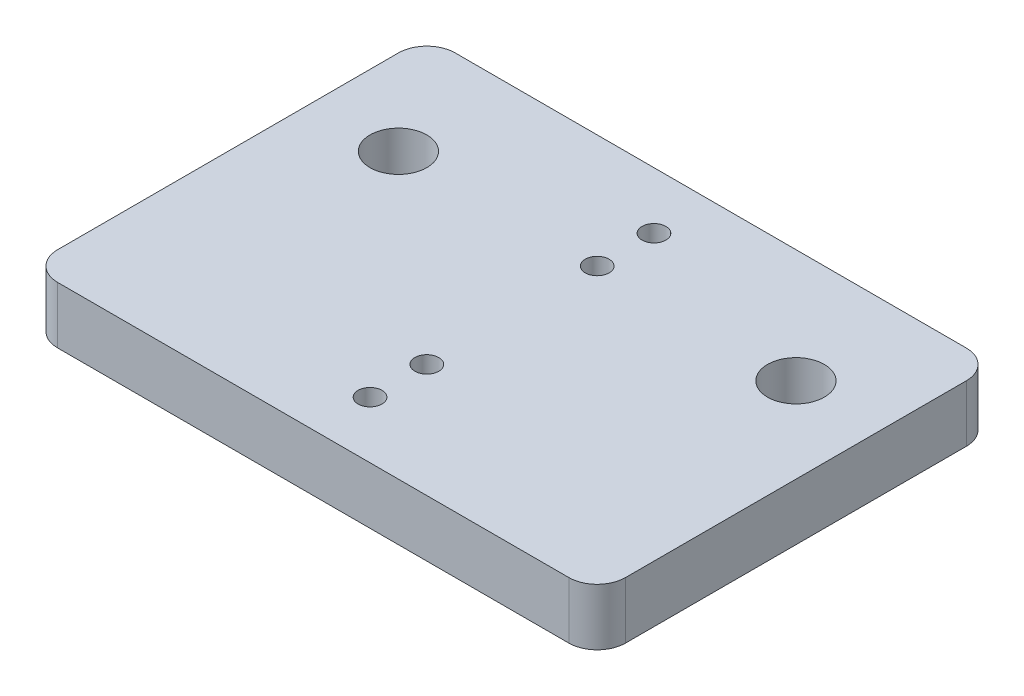
ISO-10303-21;
HEADER;
FILE_DESCRIPTION(('STEP AP214'),'2;1');
FILE_NAME('part.step','',(''),(''),'','','');
FILE_SCHEMA(('AUTOMOTIVE_DESIGN { 1 0 10303 214 1 1 1 1 }'));
ENDSEC;
DATA;
#1=APPLICATION_CONTEXT('core data for automotive mechanical design processes');
#2=APPLICATION_PROTOCOL_DEFINITION('international standard','automotive_design',2000,#1);
#3=PRODUCT_CONTEXT('',#1,'mechanical');
#4=PRODUCT('Part','Part','',(#3));
#5=PRODUCT_RELATED_PRODUCT_CATEGORY('part','',(#4));
#6=PRODUCT_DEFINITION_FORMATION('','',#4);
#7=PRODUCT_DEFINITION_CONTEXT('part definition',#1,'design');
#8=PRODUCT_DEFINITION('design','',#6,#7);
#9=PRODUCT_DEFINITION_SHAPE('','',#8);
#10=(LENGTH_UNIT() NAMED_UNIT(*) SI_UNIT(.MILLI.,.METRE.));
#11=(NAMED_UNIT(*) PLANE_ANGLE_UNIT() SI_UNIT($,.RADIAN.));
#12=(NAMED_UNIT(*) SI_UNIT($,.STERADIAN.) SOLID_ANGLE_UNIT());
#13=UNCERTAINTY_MEASURE_WITH_UNIT(LENGTH_MEASURE(1.E-05),#10,'distance_accuracy_value','');
#14=(GEOMETRIC_REPRESENTATION_CONTEXT(3) GLOBAL_UNCERTAINTY_ASSIGNED_CONTEXT((#13)) GLOBAL_UNIT_ASSIGNED_CONTEXT((#10,
#11,#12)) REPRESENTATION_CONTEXT('',''));
#15=CARTESIAN_POINT('',(0.,0.,0.));
#16=DIRECTION('',(0.,0.,1.));
#17=DIRECTION('',(1.,0.,0.));
#18=AXIS2_PLACEMENT_3D('',#15,#16,#17);
#19=CARTESIAN_POINT('',(0.,12.7,49.7470577878094));
#20=DIRECTION('',(0.,0.,-1.));
#21=DIRECTION('',(-1.,0.,0.));
#22=AXIS2_PLACEMENT_3D('',#19,#20,#21);
#23=PLANE('',#22);
#24=DIRECTION('',(1.,0.,0.));
#25=VECTOR('',#24,1.);
#26=CARTESIAN_POINT('',(0.,0.,49.7470577878094));
#27=LINE('',#26,#25);
#28=CARTESIAN_POINT('',(-57.15,0.,49.7470577878094));
#29=VERTEX_POINT('',#28);
#30=CARTESIAN_POINT('',(57.15,0.,49.7470577878094));
#31=VERTEX_POINT('',#30);
#32=EDGE_CURVE('E185',#29,#31,#27,.T.);
#33=ORIENTED_EDGE('',*,*,#32,.T.);
#34=DIRECTION('',(0.,-1.,0.));
#35=VECTOR('',#34,1.);
#36=CARTESIAN_POINT('',(57.15,12.7,49.7470577878094));
#37=LINE('',#36,#35);
#38=CARTESIAN_POINT('',(57.15,12.7,49.7470577878094));
#39=VERTEX_POINT('',#38);
#40=EDGE_CURVE('E11',#31,#39,#37,.F.);
#41=ORIENTED_EDGE('',*,*,#40,.T.);
#42=DIRECTION('',(1.,0.,0.));
#43=VECTOR('',#42,1.);
#44=CARTESIAN_POINT('',(0.,12.7,49.7470577878094));
#45=LINE('',#44,#43);
#46=CARTESIAN_POINT('',(-57.15,12.7,49.7470577878094));
#47=VERTEX_POINT('',#46);
#48=EDGE_CURVE('E160',#47,#39,#45,.T.);
#49=ORIENTED_EDGE('',*,*,#48,.F.);
#50=DIRECTION('',(0.,-1.,0.));
#51=VECTOR('',#50,1.);
#52=CARTESIAN_POINT('',(-57.15,12.7,49.7470577878094));
#53=LINE('',#52,#51);
#54=EDGE_CURVE('E48',#47,#29,#53,.T.);
#55=ORIENTED_EDGE('',*,*,#54,.T.);
#56=EDGE_LOOP('',(#33,#41,#49,#55));
#57=FACE_BOUND('',#56,.T.);
#58=ADVANCED_FACE('F40',(#57),#23,.F.);
#59=CARTESIAN_POINT('',(63.5,12.7,0.));
#60=DIRECTION('',(-1.,0.,0.));
#61=DIRECTION('',(0.,0.,1.));
#62=AXIS2_PLACEMENT_3D('',#59,#60,#61);
#63=PLANE('',#62);
#64=DIRECTION('',(0.,0.,-1.));
#65=VECTOR('',#64,1.);
#66=CARTESIAN_POINT('',(63.5,0.,0.));
#67=LINE('',#66,#65);
#68=CARTESIAN_POINT('',(63.5,0.,43.3970577878094));
#69=VERTEX_POINT('',#68);
#70=CARTESIAN_POINT('',(63.5,0.,-32.8029422121906));
#71=VERTEX_POINT('',#70);
#72=EDGE_CURVE('E140',#69,#71,#67,.T.);
#73=ORIENTED_EDGE('',*,*,#72,.T.);
#74=DIRECTION('',(0.,-1.,0.));
#75=VECTOR('',#74,1.);
#76=CARTESIAN_POINT('',(63.5,12.7,-32.8029422121906));
#77=LINE('',#76,#75);
#78=CARTESIAN_POINT('',(63.5,12.7,-32.8029422121906));
#79=VERTEX_POINT('',#78);
#80=EDGE_CURVE('E55',#71,#79,#77,.F.);
#81=ORIENTED_EDGE('',*,*,#80,.T.);
#82=DIRECTION('',(0.,0.,-1.));
#83=VECTOR('',#82,1.);
#84=CARTESIAN_POINT('',(63.5,12.7,0.));
#85=LINE('',#84,#83);
#86=CARTESIAN_POINT('',(63.5,12.7,43.3970577878094));
#87=VERTEX_POINT('',#86);
#88=EDGE_CURVE('E213',#87,#79,#85,.T.);
#89=ORIENTED_EDGE('',*,*,#88,.F.);
#90=DIRECTION('',(0.,-1.,0.));
#91=VECTOR('',#90,1.);
#92=CARTESIAN_POINT('',(63.5,12.7,43.3970577878094));
#93=LINE('',#92,#91);
#94=EDGE_CURVE('E177',#87,#69,#93,.T.);
#95=ORIENTED_EDGE('',*,*,#94,.T.);
#96=EDGE_LOOP('',(#73,#81,#89,#95));
#97=FACE_BOUND('',#96,.T.);
#98=ADVANCED_FACE('F221',(#97),#63,.F.);
#99=CARTESIAN_POINT('',(0.,12.7,-39.1529422121905));
#100=DIRECTION('',(0.,0.,-1.));
#101=DIRECTION('',(-1.,0.,0.));
#102=AXIS2_PLACEMENT_3D('',#99,#100,#101);
#103=PLANE('',#102);
#104=DIRECTION('',(1.,0.,0.));
#105=VECTOR('',#104,1.);
#106=CARTESIAN_POINT('',(0.,0.,-39.1529422121905));
#107=LINE('',#106,#105);
#108=CARTESIAN_POINT('',(-57.15,0.,-39.1529422121905));
#109=VERTEX_POINT('',#108);
#110=CARTESIAN_POINT('',(57.15,0.,-39.1529422121906));
#111=VERTEX_POINT('',#110);
#112=EDGE_CURVE('E134',#109,#111,#107,.T.);
#113=ORIENTED_EDGE('',*,*,#112,.F.);
#114=DIRECTION('',(0.,-1.,0.));
#115=VECTOR('',#114,1.);
#116=CARTESIAN_POINT('',(-57.15,12.7,-39.1529422121905));
#117=LINE('',#116,#115);
#118=CARTESIAN_POINT('',(-57.15,12.7,-39.1529422121905));
#119=VERTEX_POINT('',#118);
#120=EDGE_CURVE('E111',#109,#119,#117,.F.);
#121=ORIENTED_EDGE('',*,*,#120,.T.);
#122=DIRECTION('',(1.,0.,0.));
#123=VECTOR('',#122,1.);
#124=CARTESIAN_POINT('',(0.,12.7,-39.1529422121905));
#125=LINE('',#124,#123);
#126=CARTESIAN_POINT('',(57.15,12.7,-39.1529422121906));
#127=VERTEX_POINT('',#126);
#128=EDGE_CURVE('E210',#119,#127,#125,.T.);
#129=ORIENTED_EDGE('',*,*,#128,.T.);
#130=DIRECTION('',(0.,-1.,0.));
#131=VECTOR('',#130,1.);
#132=CARTESIAN_POINT('',(57.15,0.,-39.1529422121906));
#133=LINE('',#132,#131);
#134=EDGE_CURVE('E116',#127,#111,#133,.T.);
#135=ORIENTED_EDGE('',*,*,#134,.T.);
#136=EDGE_LOOP('',(#113,#121,#129,#135));
#137=FACE_BOUND('',#136,.T.);
#138=ADVANCED_FACE('F227',(#137),#103,.T.);
#139=CARTESIAN_POINT('',(0.,12.7,-13.7529422121905));
#140=DIRECTION('',(0.,-1.,0.));
#141=DIRECTION('',(0.,0.,-1.));
#142=AXIS2_PLACEMENT_3D('',#139,#140,#141);
#143=CYLINDRICAL_SURFACE('',#142,2.66699999999798);
#144=CARTESIAN_POINT('',(0.,12.7,-13.7529422121905));
#145=DIRECTION('',(0.,1.,0.));
#146=DIRECTION('',(0.,0.,1.));
#147=AXIS2_PLACEMENT_3D('',#144,#145,#146);
#148=CIRCLE('',#147,2.66699999999798);
#149=CARTESIAN_POINT('',(0.,12.7,-11.0859422121926));
#150=VERTEX_POINT('',#149);
#151=EDGE_CURVE('E194',#150,#150,#148,.T.);
#152=ORIENTED_EDGE('',*,*,#151,.T.);
#153=EDGE_LOOP('',(#152));
#154=FACE_BOUND('',#153,.T.);
#155=CARTESIAN_POINT('',(0.,0.,-13.7529422121905));
#156=DIRECTION('',(0.,1.,0.));
#157=DIRECTION('',(0.,0.,1.));
#158=AXIS2_PLACEMENT_3D('',#155,#156,#157);
#159=CIRCLE('',#158,2.66699999999798);
#160=CARTESIAN_POINT('',(0.,0.,-11.0859422121926));
#161=VERTEX_POINT('',#160);
#162=EDGE_CURVE('E153',#161,#161,#159,.T.);
#163=ORIENTED_EDGE('',*,*,#162,.F.);
#164=EDGE_LOOP('',(#163));
#165=FACE_BOUND('',#164,.T.);
#166=ADVANCED_FACE('F306',(#154,#165),#143,.F.);
#167=CARTESIAN_POINT('',(0.,12.7,-26.4529422121905));
#168=DIRECTION('',(0.,-1.,0.));
#169=DIRECTION('',(0.,0.,-1.));
#170=AXIS2_PLACEMENT_3D('',#167,#168,#169);
#171=CYLINDRICAL_SURFACE('',#170,2.66699999999798);
#172=CARTESIAN_POINT('',(0.,12.7,-26.4529422121905));
#173=DIRECTION('',(0.,1.,0.));
#174=DIRECTION('',(0.,0.,1.));
#175=AXIS2_PLACEMENT_3D('',#172,#173,#174);
#176=CIRCLE('',#175,2.66699999999798);
#177=CARTESIAN_POINT('',(0.,12.7,-23.7859422121926));
#178=VERTEX_POINT('',#177);
#179=EDGE_CURVE('E197',#178,#178,#176,.T.);
#180=ORIENTED_EDGE('',*,*,#179,.T.);
#181=EDGE_LOOP('',(#180));
#182=FACE_BOUND('',#181,.T.);
#183=CARTESIAN_POINT('',(0.,0.,-26.4529422121905));
#184=DIRECTION('',(0.,1.,0.));
#185=DIRECTION('',(0.,0.,1.));
#186=AXIS2_PLACEMENT_3D('',#183,#184,#185);
#187=CIRCLE('',#186,2.66699999999798);
#188=CARTESIAN_POINT('',(0.,0.,-23.7859422121926));
#189=VERTEX_POINT('',#188);
#190=EDGE_CURVE('E150',#189,#189,#187,.T.);
#191=ORIENTED_EDGE('',*,*,#190,.F.);
#192=EDGE_LOOP('',(#191));
#193=FACE_BOUND('',#192,.T.);
#194=ADVANCED_FACE('F357',(#182,#193),#171,.F.);
#195=CARTESIAN_POINT('',(44.45,12.7,-13.7529422121905));
#196=DIRECTION('',(0.,-1.,0.));
#197=DIRECTION('',(0.,0.,-1.));
#198=AXIS2_PLACEMENT_3D('',#195,#196,#197);
#199=CYLINDRICAL_SURFACE('',#198,6.34999999999799);
#200=CARTESIAN_POINT('',(44.45,12.7,-13.7529422121905));
#201=DIRECTION('',(0.,1.,0.));
#202=DIRECTION('',(0.,0.,1.));
#203=AXIS2_PLACEMENT_3D('',#200,#201,#202);
#204=CIRCLE('',#203,6.34999999999799);
#205=CARTESIAN_POINT('',(44.45,12.7,-7.40294221219256));
#206=VERTEX_POINT('',#205);
#207=EDGE_CURVE('E200',#206,#206,#204,.T.);
#208=ORIENTED_EDGE('',*,*,#207,.T.);
#209=EDGE_LOOP('',(#208));
#210=FACE_BOUND('',#209,.T.);
#211=CARTESIAN_POINT('',(44.45,0.,-13.7529422121905));
#212=DIRECTION('',(0.,1.,0.));
#213=DIRECTION('',(0.,0.,1.));
#214=AXIS2_PLACEMENT_3D('',#211,#212,#213);
#215=CIRCLE('',#214,6.34999999999799);
#216=CARTESIAN_POINT('',(44.45,0.,-7.40294221219256));
#217=VERTEX_POINT('',#216);
#218=EDGE_CURVE('E146',#217,#217,#215,.T.);
#219=ORIENTED_EDGE('',*,*,#218,.F.);
#220=EDGE_LOOP('',(#219));
#221=FACE_BOUND('',#220,.T.);
#222=ADVANCED_FACE('F348',(#210,#221),#199,.F.);
#223=CARTESIAN_POINT('',(0.,12.7,37.0470577878094));
#224=DIRECTION('',(0.,-1.,0.));
#225=DIRECTION('',(0.,0.,-1.));
#226=AXIS2_PLACEMENT_3D('',#223,#224,#225);
#227=CYLINDRICAL_SURFACE('',#226,2.66699999999798);
#228=CARTESIAN_POINT('',(0.,12.7,37.0470577878094));
#229=DIRECTION('',(0.,1.,0.));
#230=DIRECTION('',(0.,0.,1.));
#231=AXIS2_PLACEMENT_3D('',#228,#229,#230);
#232=CIRCLE('',#231,2.66699999999798);
#233=CARTESIAN_POINT('',(0.,12.7,39.7140577878074));
#234=VERTEX_POINT('',#233);
#235=EDGE_CURVE('E203',#234,#234,#232,.T.);
#236=ORIENTED_EDGE('',*,*,#235,.T.);
#237=EDGE_LOOP('',(#236));
#238=FACE_BOUND('',#237,.T.);
#239=CARTESIAN_POINT('',(0.,0.,37.0470577878094));
#240=DIRECTION('',(0.,1.,0.));
#241=DIRECTION('',(0.,0.,1.));
#242=AXIS2_PLACEMENT_3D('',#239,#240,#241);
#243=CIRCLE('',#242,2.66699999999798);
#244=CARTESIAN_POINT('',(0.,0.,39.7140577878074));
#245=VERTEX_POINT('',#244);
#246=EDGE_CURVE('E137',#245,#245,#243,.T.);
#247=ORIENTED_EDGE('',*,*,#246,.F.);
#248=EDGE_LOOP('',(#247));
#249=FACE_BOUND('',#248,.T.);
#250=ADVANCED_FACE('F337',(#238,#249),#227,.F.);
#251=CARTESIAN_POINT('',(0.,12.7,24.3470577878094));
#252=DIRECTION('',(0.,-1.,0.));
#253=DIRECTION('',(0.,0.,-1.));
#254=AXIS2_PLACEMENT_3D('',#251,#252,#253);
#255=CYLINDRICAL_SURFACE('',#254,2.66699999999798);
#256=CARTESIAN_POINT('',(0.,12.7,24.3470577878094));
#257=DIRECTION('',(0.,1.,0.));
#258=DIRECTION('',(0.,0.,1.));
#259=AXIS2_PLACEMENT_3D('',#256,#257,#258);
#260=CIRCLE('',#259,2.66699999999798);
#261=CARTESIAN_POINT('',(0.,12.7,27.0140577878074));
#262=VERTEX_POINT('',#261);
#263=EDGE_CURVE('E206',#262,#262,#260,.T.);
#264=ORIENTED_EDGE('',*,*,#263,.T.);
#265=EDGE_LOOP('',(#264));
#266=FACE_BOUND('',#265,.T.);
#267=CARTESIAN_POINT('',(0.,0.,24.3470577878094));
#268=DIRECTION('',(0.,1.,0.));
#269=DIRECTION('',(0.,0.,1.));
#270=AXIS2_PLACEMENT_3D('',#267,#268,#269);
#271=CIRCLE('',#270,2.66699999999798);
#272=CARTESIAN_POINT('',(0.,0.,27.0140577878074));
#273=VERTEX_POINT('',#272);
#274=EDGE_CURVE('E133',#273,#273,#271,.T.);
#275=ORIENTED_EDGE('',*,*,#274,.F.);
#276=EDGE_LOOP('',(#275));
#277=FACE_BOUND('',#276,.T.);
#278=ADVANCED_FACE('F294',(#266,#277),#255,.F.);
#279=CARTESIAN_POINT('',(-63.5,12.7,0.));
#280=DIRECTION('',(1.,0.,0.));
#281=DIRECTION('',(0.,0.,-1.));
#282=AXIS2_PLACEMENT_3D('',#279,#280,#281);
#283=PLANE('',#282);
#284=DIRECTION('',(0.,0.,1.));
#285=VECTOR('',#284,1.);
#286=CARTESIAN_POINT('',(-63.5,12.7,0.));
#287=LINE('',#286,#285);
#288=CARTESIAN_POINT('',(-63.5,12.7,-32.8029422121905));
#289=VERTEX_POINT('',#288);
#290=CARTESIAN_POINT('',(-63.5,12.7,43.3970577878094));
#291=VERTEX_POINT('',#290);
#292=EDGE_CURVE('E126',#289,#291,#287,.T.);
#293=ORIENTED_EDGE('',*,*,#292,.F.);
#294=DIRECTION('',(0.,-1.,0.));
#295=VECTOR('',#294,1.);
#296=CARTESIAN_POINT('',(-63.5,0.,-32.8029422121905));
#297=LINE('',#296,#295);
#298=CARTESIAN_POINT('',(-63.5,0.,-32.8029422121905));
#299=VERTEX_POINT('',#298);
#300=EDGE_CURVE('E110',#289,#299,#297,.T.);
#301=ORIENTED_EDGE('',*,*,#300,.T.);
#302=DIRECTION('',(0.,0.,1.));
#303=VECTOR('',#302,1.);
#304=CARTESIAN_POINT('',(-63.5,0.,0.));
#305=LINE('',#304,#303);
#306=CARTESIAN_POINT('',(-63.5,0.,43.3970577878094));
#307=VERTEX_POINT('',#306);
#308=EDGE_CURVE('E123',#299,#307,#305,.T.);
#309=ORIENTED_EDGE('',*,*,#308,.T.);
#310=DIRECTION('',(0.,-1.,0.));
#311=VECTOR('',#310,1.);
#312=CARTESIAN_POINT('',(-63.5,12.7,43.3970577878094));
#313=LINE('',#312,#311);
#314=EDGE_CURVE('E128',#307,#291,#313,.F.);
#315=ORIENTED_EDGE('',*,*,#314,.T.);
#316=EDGE_LOOP('',(#293,#301,#309,#315));
#317=FACE_BOUND('',#316,.T.);
#318=ADVANCED_FACE('F122',(#317),#283,.F.);
#319=CARTESIAN_POINT('',(-44.45,12.7,-13.7529422121905));
#320=DIRECTION('',(0.,-1.,0.));
#321=DIRECTION('',(0.,0.,-1.));
#322=AXIS2_PLACEMENT_3D('',#319,#320,#321);
#323=CYLINDRICAL_SURFACE('',#322,6.34999999999798);
#324=CARTESIAN_POINT('',(-44.45,12.7,-13.7529422121905));
#325=DIRECTION('',(0.,1.,0.));
#326=DIRECTION('',(0.,0.,1.));
#327=AXIS2_PLACEMENT_3D('',#324,#325,#326);
#328=CIRCLE('',#327,6.34999999999798);
#329=CARTESIAN_POINT('',(-44.45,12.7,-7.40294221219256));
#330=VERTEX_POINT('',#329);
#331=EDGE_CURVE('E161',#330,#330,#328,.T.);
#332=ORIENTED_EDGE('',*,*,#331,.T.);
#333=EDGE_LOOP('',(#332));
#334=FACE_BOUND('',#333,.T.);
#335=CARTESIAN_POINT('',(-44.45,0.,-13.7529422121905));
#336=DIRECTION('',(0.,1.,0.));
#337=DIRECTION('',(0.,0.,1.));
#338=AXIS2_PLACEMENT_3D('',#335,#336,#337);
#339=CIRCLE('',#338,6.34999999999798);
#340=CARTESIAN_POINT('',(-44.45,0.,-7.40294221219256));
#341=VERTEX_POINT('',#340);
#342=EDGE_CURVE('E156',#341,#341,#339,.T.);
#343=ORIENTED_EDGE('',*,*,#342,.F.);
#344=EDGE_LOOP('',(#343));
#345=FACE_BOUND('',#344,.T.);
#346=ADVANCED_FACE('F282',(#334,#345),#323,.F.);
#347=CARTESIAN_POINT('',(0.,12.7,0.));
#348=DIRECTION('',(0.,1.,0.));
#349=DIRECTION('',(0.,0.,1.));
#350=AXIS2_PLACEMENT_3D('',#347,#348,#349);
#351=PLANE('',#350);
#352=ORIENTED_EDGE('',*,*,#128,.F.);
#353=CARTESIAN_POINT('',(-57.15,12.7,-32.8029422121905));
#354=DIRECTION('',(0.,1.,0.));
#355=DIRECTION('',(0.,0.,1.));
#356=AXIS2_PLACEMENT_3D('',#353,#354,#355);
#357=CIRCLE('',#356,6.35);
#358=EDGE_CURVE('E175',#119,#289,#357,.T.);
#359=ORIENTED_EDGE('',*,*,#358,.T.);
#360=ORIENTED_EDGE('',*,*,#292,.T.);
#361=CARTESIAN_POINT('',(-57.15,12.7,43.3970577878094));
#362=DIRECTION('',(0.,1.,0.));
#363=DIRECTION('',(0.,0.,1.));
#364=AXIS2_PLACEMENT_3D('',#361,#362,#363);
#365=CIRCLE('',#364,6.35);
#366=EDGE_CURVE('E170',#291,#47,#365,.T.);
#367=ORIENTED_EDGE('',*,*,#366,.T.);
#368=ORIENTED_EDGE('',*,*,#48,.T.);
#369=CARTESIAN_POINT('',(57.15,12.7,43.3970577878094));
#370=DIRECTION('',(0.,1.,0.));
#371=DIRECTION('',(0.,0.,1.));
#372=AXIS2_PLACEMENT_3D('',#369,#370,#371);
#373=CIRCLE('',#372,6.35);
#374=EDGE_CURVE('E62',#39,#87,#373,.T.);
#375=ORIENTED_EDGE('',*,*,#374,.T.);
#376=ORIENTED_EDGE('',*,*,#88,.T.);
#377=CARTESIAN_POINT('',(57.15,12.7,-32.8029422121906));
#378=DIRECTION('',(0.,1.,0.));
#379=DIRECTION('',(0.,0.,1.));
#380=AXIS2_PLACEMENT_3D('',#377,#378,#379);
#381=CIRCLE('',#380,6.35);
#382=EDGE_CURVE('E173',#79,#127,#381,.T.);
#383=ORIENTED_EDGE('',*,*,#382,.T.);
#384=EDGE_LOOP('',(#352,#359,#360,#367,#368,#375,#376,#383));
#385=FACE_BOUND('',#384,.T.);
#386=ORIENTED_EDGE('',*,*,#263,.F.);
#387=EDGE_LOOP('',(#386));
#388=FACE_BOUND('',#387,.T.);
#389=ORIENTED_EDGE('',*,*,#235,.F.);
#390=EDGE_LOOP('',(#389));
#391=FACE_BOUND('',#390,.T.);
#392=ORIENTED_EDGE('',*,*,#207,.F.);
#393=EDGE_LOOP('',(#392));
#394=FACE_BOUND('',#393,.T.);
#395=ORIENTED_EDGE('',*,*,#179,.F.);
#396=EDGE_LOOP('',(#395));
#397=FACE_BOUND('',#396,.T.);
#398=ORIENTED_EDGE('',*,*,#151,.F.);
#399=EDGE_LOOP('',(#398));
#400=FACE_BOUND('',#399,.T.);
#401=ORIENTED_EDGE('',*,*,#331,.F.);
#402=EDGE_LOOP('',(#401));
#403=FACE_BOUND('',#402,.T.);
#404=ADVANCED_FACE('F216',(#385,#388,#391,#394,#397,#400,#403),#351,.T.);
#405=CARTESIAN_POINT('',(0.,0.,0.));
#406=DIRECTION('',(0.,1.,0.));
#407=DIRECTION('',(0.,0.,1.));
#408=AXIS2_PLACEMENT_3D('',#405,#406,#407);
#409=PLANE('',#408);
#410=ORIENTED_EDGE('',*,*,#308,.F.);
#411=CARTESIAN_POINT('',(-57.15,0.,-32.8029422121905));
#412=DIRECTION('',(0.,1.,0.));
#413=DIRECTION('',(0.,0.,1.));
#414=AXIS2_PLACEMENT_3D('',#411,#412,#413);
#415=CIRCLE('',#414,6.35);
#416=EDGE_CURVE('E106',#299,#109,#415,.F.);
#417=ORIENTED_EDGE('',*,*,#416,.T.);
#418=ORIENTED_EDGE('',*,*,#112,.T.);
#419=CARTESIAN_POINT('',(57.15,0.,-32.8029422121906));
#420=DIRECTION('',(0.,1.,0.));
#421=DIRECTION('',(0.,0.,1.));
#422=AXIS2_PLACEMENT_3D('',#419,#420,#421);
#423=CIRCLE('',#422,6.35);
#424=EDGE_CURVE('E117',#111,#71,#423,.F.);
#425=ORIENTED_EDGE('',*,*,#424,.T.);
#426=ORIENTED_EDGE('',*,*,#72,.F.);
#427=CARTESIAN_POINT('',(57.15,0.,43.3970577878094));
#428=DIRECTION('',(0.,1.,0.));
#429=DIRECTION('',(0.,0.,1.));
#430=AXIS2_PLACEMENT_3D('',#427,#428,#429);
#431=CIRCLE('',#430,6.35);
#432=EDGE_CURVE('E164',#69,#31,#431,.F.);
#433=ORIENTED_EDGE('',*,*,#432,.T.);
#434=ORIENTED_EDGE('',*,*,#32,.F.);
#435=CARTESIAN_POINT('',(-57.15,0.,43.3970577878094));
#436=DIRECTION('',(0.,1.,0.));
#437=DIRECTION('',(0.,0.,1.));
#438=AXIS2_PLACEMENT_3D('',#435,#436,#437);
#439=CIRCLE('',#438,6.35);
#440=EDGE_CURVE('E127',#29,#307,#439,.F.);
#441=ORIENTED_EDGE('',*,*,#440,.T.);
#442=EDGE_LOOP('',(#410,#417,#418,#425,#426,#433,#434,#441));
#443=FACE_BOUND('',#442,.T.);
#444=ORIENTED_EDGE('',*,*,#274,.T.);
#445=EDGE_LOOP('',(#444));
#446=FACE_BOUND('',#445,.T.);
#447=ORIENTED_EDGE('',*,*,#246,.T.);
#448=EDGE_LOOP('',(#447));
#449=FACE_BOUND('',#448,.T.);
#450=ORIENTED_EDGE('',*,*,#218,.T.);
#451=EDGE_LOOP('',(#450));
#452=FACE_BOUND('',#451,.T.);
#453=ORIENTED_EDGE('',*,*,#190,.T.);
#454=EDGE_LOOP('',(#453));
#455=FACE_BOUND('',#454,.T.);
#456=ORIENTED_EDGE('',*,*,#162,.T.);
#457=EDGE_LOOP('',(#456));
#458=FACE_BOUND('',#457,.T.);
#459=ORIENTED_EDGE('',*,*,#342,.T.);
#460=EDGE_LOOP('',(#459));
#461=FACE_BOUND('',#460,.T.);
#462=ADVANCED_FACE('F130',(#443,#446,#449,#452,#455,#458,#461),#409,.F.);
#463=CARTESIAN_POINT('',(-57.15,12.7,-32.8029422121905));
#464=DIRECTION('',(0.,1.,0.));
#465=DIRECTION('',(0.,0.,1.));
#466=AXIS2_PLACEMENT_3D('',#463,#464,#465);
#467=CYLINDRICAL_SURFACE('',#466,6.35);
#468=ORIENTED_EDGE('',*,*,#358,.F.);
#469=ORIENTED_EDGE('',*,*,#120,.F.);
#470=ORIENTED_EDGE('',*,*,#416,.F.);
#471=ORIENTED_EDGE('',*,*,#300,.F.);
#472=EDGE_LOOP('',(#468,#469,#470,#471));
#473=FACE_BOUND('',#472,.T.);
#474=ADVANCED_FACE('F109',(#473),#467,.T.);
#475=CARTESIAN_POINT('',(57.15,12.7,-32.8029422121906));
#476=DIRECTION('',(0.,1.,0.));
#477=DIRECTION('',(0.,0.,1.));
#478=AXIS2_PLACEMENT_3D('',#475,#476,#477);
#479=CYLINDRICAL_SURFACE('',#478,6.35);
#480=ORIENTED_EDGE('',*,*,#382,.F.);
#481=ORIENTED_EDGE('',*,*,#80,.F.);
#482=ORIENTED_EDGE('',*,*,#424,.F.);
#483=ORIENTED_EDGE('',*,*,#134,.F.);
#484=EDGE_LOOP('',(#480,#481,#482,#483));
#485=FACE_BOUND('',#484,.T.);
#486=ADVANCED_FACE('F225',(#485),#479,.T.);
#487=CARTESIAN_POINT('',(57.15,12.7,43.3970577878094));
#488=DIRECTION('',(0.,-1.,0.));
#489=DIRECTION('',(0.,0.,-1.));
#490=AXIS2_PLACEMENT_3D('',#487,#488,#489);
#491=CYLINDRICAL_SURFACE('',#490,6.35);
#492=ORIENTED_EDGE('',*,*,#374,.F.);
#493=ORIENTED_EDGE('',*,*,#40,.F.);
#494=ORIENTED_EDGE('',*,*,#432,.F.);
#495=ORIENTED_EDGE('',*,*,#94,.F.);
#496=EDGE_LOOP('',(#492,#493,#494,#495));
#497=FACE_BOUND('',#496,.T.);
#498=ADVANCED_FACE('F220',(#497),#491,.T.);
#499=CARTESIAN_POINT('',(-57.15,12.7,43.3970577878094));
#500=DIRECTION('',(0.,-1.,0.));
#501=DIRECTION('',(0.,0.,-1.));
#502=AXIS2_PLACEMENT_3D('',#499,#500,#501);
#503=CYLINDRICAL_SURFACE('',#502,6.35);
#504=ORIENTED_EDGE('',*,*,#366,.F.);
#505=ORIENTED_EDGE('',*,*,#314,.F.);
#506=ORIENTED_EDGE('',*,*,#440,.F.);
#507=ORIENTED_EDGE('',*,*,#54,.F.);
#508=EDGE_LOOP('',(#504,#505,#506,#507));
#509=FACE_BOUND('',#508,.T.);
#510=ADVANCED_FACE('F42',(#509),#503,.T.);
#511=CLOSED_SHELL('',(#58,#98,#138,#166,#194,#222,#250,#278,#318,#346,#404,#462,#474,#486,#498,#510));
#512=MANIFOLD_SOLID_BREP('B2',#511);
#513=ADVANCED_BREP_SHAPE_REPRESENTATION('',(#18,#512),#14);
#514=SHAPE_DEFINITION_REPRESENTATION(#9,#513);
ENDSEC;
END-ISO-10303-21;
